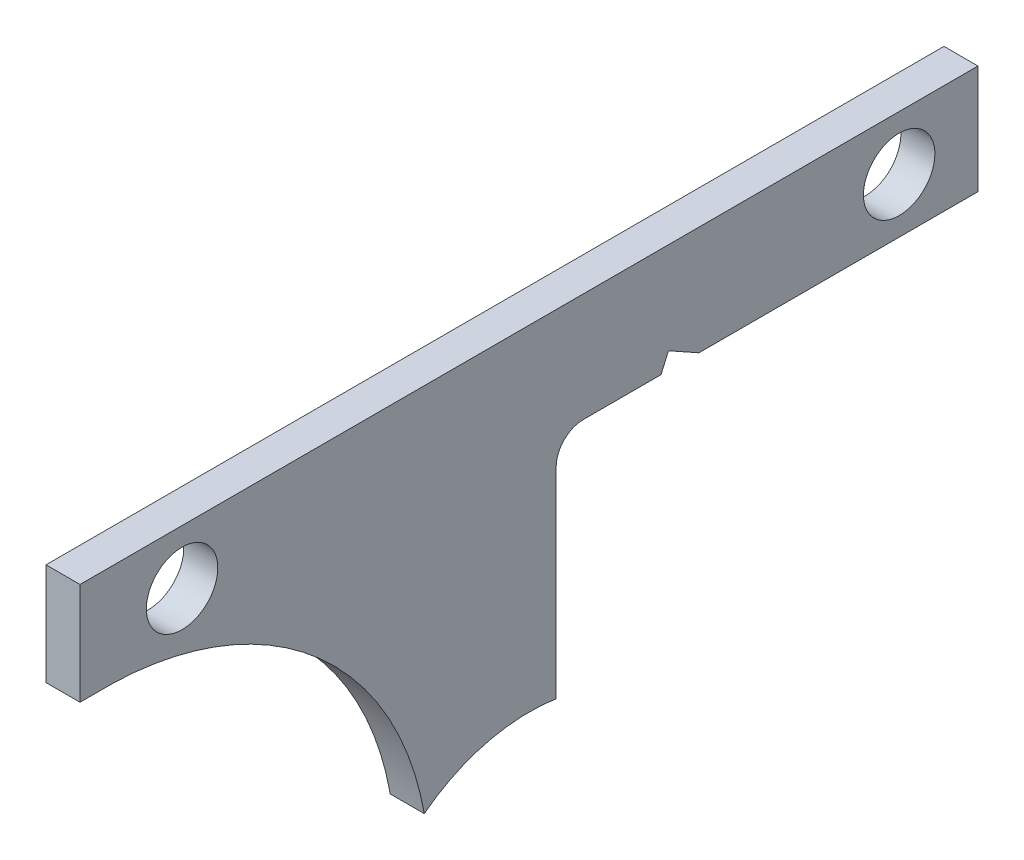
ISO-10303-21;
HEADER;
FILE_DESCRIPTION(('STEP AP214'),'2;1');
FILE_NAME('part.step','',(''),(''),'','','');
FILE_SCHEMA(('AUTOMOTIVE_DESIGN { 1 0 10303 214 1 1 1 1 }'));
ENDSEC;
DATA;
#1=APPLICATION_CONTEXT('core data for automotive mechanical design processes');
#2=APPLICATION_PROTOCOL_DEFINITION('international standard','automotive_design',2000,#1);
#3=PRODUCT_CONTEXT('',#1,'mechanical');
#4=PRODUCT('Part','Part','',(#3));
#5=PRODUCT_RELATED_PRODUCT_CATEGORY('part','',(#4));
#6=PRODUCT_DEFINITION_FORMATION('','',#4);
#7=PRODUCT_DEFINITION_CONTEXT('part definition',#1,'design');
#8=PRODUCT_DEFINITION('design','',#6,#7);
#9=PRODUCT_DEFINITION_SHAPE('','',#8);
#10=(LENGTH_UNIT() NAMED_UNIT(*) SI_UNIT(.MILLI.,.METRE.));
#11=(NAMED_UNIT(*) PLANE_ANGLE_UNIT() SI_UNIT($,.RADIAN.));
#12=(NAMED_UNIT(*) SI_UNIT($,.STERADIAN.) SOLID_ANGLE_UNIT());
#13=UNCERTAINTY_MEASURE_WITH_UNIT(LENGTH_MEASURE(1.E-05),#10,'distance_accuracy_value','');
#14=(GEOMETRIC_REPRESENTATION_CONTEXT(3) GLOBAL_UNCERTAINTY_ASSIGNED_CONTEXT((#13)) GLOBAL_UNIT_ASSIGNED_CONTEXT((#10,
#11,#12)) REPRESENTATION_CONTEXT('',''));
#15=CARTESIAN_POINT('',(0.,0.,0.));
#16=DIRECTION('',(0.,0.,1.));
#17=DIRECTION('',(1.,0.,0.));
#18=AXIS2_PLACEMENT_3D('',#15,#16,#17);
#19=CARTESIAN_POINT('',(-316.5,185.,219.999999999998));
#20=CARTESIAN_POINT('',(-316.5,183.738271044699,181.204081790223));
#21=CARTESIAN_POINT('',(-316.5,145.523335737097,174.397177271133));
#22=CARTESIAN_POINT('',(-321.5,185.,219.999999999998));
#23=CARTESIAN_POINT('',(-321.5,183.738271044699,181.204081790223));
#24=CARTESIAN_POINT('',(-321.5,145.523335737097,174.397177271133));
#25=(BOUNDED_SURFACE() B_SPLINE_SURFACE(1,2,((#19,#20,#21),(#22,#23,#24)),.UNSPECIFIED.,.F.,.F.,
.F.) B_SPLINE_SURFACE_WITH_KNOTS((2,2),(3,3),(-0.0104379405019257,0.0939414645173316),
(0.0325107499581212,1.3945234553188),
.UNSPECIFIED.) GEOMETRIC_REPRESENTATION_ITEM() RATIONAL_B_SPLINE_SURFACE(((1.,0.776939537570949,
1.),(1.,0.776939537570949,1.))) REPRESENTATION_ITEM('') SURFACE());
#26=CARTESIAN_POINT('',(-321.5,145.523335737097,174.397177271133));
#27=CARTESIAN_POINT('',(-321.5,183.738271044699,181.204081790223));
#28=CARTESIAN_POINT('',(-321.5,185.,219.999999999998));
#29=(BOUNDED_CURVE() B_SPLINE_CURVE(2,(#26,#27,#28),.UNSPECIFIED.,.F.,
.F.) B_SPLINE_CURVE_WITH_KNOTS((3,3),(-1.3945234553188,-0.0325107499581212),
.UNSPECIFIED.) CURVE() GEOMETRIC_REPRESENTATION_ITEM() RATIONAL_B_SPLINE_CURVE((1.,
0.776939537570949,1.)) REPRESENTATION_ITEM(''));
#30=CARTESIAN_POINT('',(-321.5,145.523335737097,174.397177271133));
#31=VERTEX_POINT('',#30);
#32=CARTESIAN_POINT('',(-321.5,185.,219.999999999998));
#33=VERTEX_POINT('',#32);
#34=EDGE_CURVE('E11',#31,#33,#29,.T.);
#35=CARTESIAN_POINT('',(-316.5,145.523335737097,174.397177271133));
#36=CARTESIAN_POINT('',(-321.5,145.523335737097,174.397177271133));
#37=(BOUNDED_CURVE() B_SPLINE_CURVE(1,(#35,#36),.UNSPECIFIED.,.F.,
.F.) B_SPLINE_CURVE_WITH_KNOTS((2,2),(-0.45,0.05),
.UNSPECIFIED.) CURVE() GEOMETRIC_REPRESENTATION_ITEM() RATIONAL_B_SPLINE_CURVE((1.,1.)) REPRESENTATION_ITEM(''));
#38=CARTESIAN_POINT('',(-316.5,145.523335737097,174.397177271133));
#39=VERTEX_POINT('',#38);
#40=EDGE_CURVE('E40',#39,#31,#37,.T.);
#41=CARTESIAN_POINT('',(-316.5,185.,219.999999999998));
#42=CARTESIAN_POINT('',(-316.5,183.738271044699,181.204081790223));
#43=CARTESIAN_POINT('',(-316.5,145.523335737097,174.397177271133));
#44=(BOUNDED_CURVE() B_SPLINE_CURVE(2,(#41,#42,#43),.UNSPECIFIED.,.F.,
.F.) B_SPLINE_CURVE_WITH_KNOTS((3,3),(0.0325107499581212,1.3945234553188),
.UNSPECIFIED.) CURVE() GEOMETRIC_REPRESENTATION_ITEM() RATIONAL_B_SPLINE_CURVE((1.,
0.776939537570949,1.)) REPRESENTATION_ITEM(''));
#45=CARTESIAN_POINT('',(-316.5,185.,219.999999999998));
#46=VERTEX_POINT('',#45);
#47=EDGE_CURVE('E149',#46,#39,#44,.T.);
#48=CARTESIAN_POINT('',(-321.5,185.,219.999999999998));
#49=CARTESIAN_POINT('',(-316.5,185.,219.999999999998));
#50=(BOUNDED_CURVE() B_SPLINE_CURVE(1,(#48,#49),.UNSPECIFIED.,.F.,
.F.) B_SPLINE_CURVE_WITH_KNOTS((2,2),(-0.05,0.45),
.UNSPECIFIED.) CURVE() GEOMETRIC_REPRESENTATION_ITEM() RATIONAL_B_SPLINE_CURVE((1.,1.)) REPRESENTATION_ITEM(''));
#51=EDGE_CURVE('E179',#33,#46,#50,.T.);
#52=ORIENTED_EDGE('',*,*,#34,.F.);
#53=ORIENTED_EDGE('',*,*,#40,.F.);
#54=ORIENTED_EDGE('',*,*,#47,.F.);
#55=ORIENTED_EDGE('',*,*,#51,.F.);
#56=EDGE_LOOP('',(#52,#53,#54,#55));
#57=FACE_BOUND('',#56,.T.);
#58=ADVANCED_FACE('F16',(#57),#25,.T.);
#59=CARTESIAN_POINT('',(-321.5,145.513335737097,225.009999999998));
#60=CARTESIAN_POINT('',(-321.5,145.513335737097,92.9900013881491));
#61=CARTESIAN_POINT('',(-321.5,200.01,225.009999999998));
#62=CARTESIAN_POINT('',(-321.5,200.01,92.9900013881491));
#63=(BOUNDED_SURFACE() B_SPLINE_SURFACE(1,1,((#59,#60),(#61,#62)),.UNSPECIFIED.,.F.,.F.,
.F.) B_SPLINE_SURFACE_WITH_KNOTS((2,2),(2,2),(1.2513335737095,6.70099999999985),
(-6.50099999999984,6.70099986118509),
.UNSPECIFIED.) GEOMETRIC_REPRESENTATION_ITEM() RATIONAL_B_SPLINE_SURFACE(((1.,1.),(1.,1.))) REPRESENTATION_ITEM('') SURFACE());
#64=CARTESIAN_POINT('',(-321.5,185.,219.999999999998));
#65=CARTESIAN_POINT('',(-321.5,185.,224.999999999998));
#66=(BOUNDED_CURVE() B_SPLINE_CURVE(1,(#64,#65),.UNSPECIFIED.,.F.,
.F.) B_SPLINE_CURVE_WITH_KNOTS((2,2),(2.99999999999992,3.49999999999992),
.UNSPECIFIED.) CURVE() GEOMETRIC_REPRESENTATION_ITEM() RATIONAL_B_SPLINE_CURVE((1.,1.)) REPRESENTATION_ITEM(''));
#67=CARTESIAN_POINT('',(-321.5,185.,224.999999999998));
#68=VERTEX_POINT('',#67);
#69=EDGE_CURVE('E31',#33,#68,#66,.T.);
#70=CARTESIAN_POINT('',(-321.5,200.,224.999999999998));
#71=CARTESIAN_POINT('',(-321.5,185.,224.999999999998));
#72=(BOUNDED_CURVE() B_SPLINE_CURVE(1,(#70,#71),.UNSPECIFIED.,.F.,
.F.) B_SPLINE_CURVE_WITH_KNOTS((2,2),(-3.29999999999992,-1.79999999999992),
.UNSPECIFIED.) CURVE() GEOMETRIC_REPRESENTATION_ITEM() RATIONAL_B_SPLINE_CURVE((1.,1.)) REPRESENTATION_ITEM(''));
#73=CARTESIAN_POINT('',(-321.5,200.,224.999999999998));
#74=VERTEX_POINT('',#73);
#75=EDGE_CURVE('E227',#74,#68,#72,.T.);
#76=CARTESIAN_POINT('',(-321.5,200.,93.0000013881491));
#77=CARTESIAN_POINT('',(-321.5,200.,224.999999999998));
#78=(BOUNDED_CURVE() B_SPLINE_CURVE(1,(#76,#77),.UNSPECIFIED.,.F.,
.F.) B_SPLINE_CURVE_WITH_KNOTS((2,2),(-3.7000609657488,9.49993889543614),
.UNSPECIFIED.) CURVE() GEOMETRIC_REPRESENTATION_ITEM() RATIONAL_B_SPLINE_CURVE((1.,1.)) REPRESENTATION_ITEM(''));
#79=CARTESIAN_POINT('',(-321.5,200.,93.0000013881491));
#80=VERTEX_POINT('',#79);
#81=EDGE_CURVE('E387',#80,#74,#78,.T.);
#82=CARTESIAN_POINT('',(-321.5,184.000001489994,93.0000013881491));
#83=CARTESIAN_POINT('',(-321.5,200.,93.0000013881491));
#84=(BOUNDED_CURVE() B_SPLINE_CURVE(1,(#82,#83),.UNSPECIFIED.,.F.,
.F.) B_SPLINE_CURVE_WITH_KNOTS((2,2),(2.45000014899932,4.04999999999992),
.UNSPECIFIED.) CURVE() GEOMETRIC_REPRESENTATION_ITEM() RATIONAL_B_SPLINE_CURVE((1.,1.)) REPRESENTATION_ITEM(''));
#85=CARTESIAN_POINT('',(-321.5,184.000001489994,93.0000013881491));
#86=VERTEX_POINT('',#85);
#87=EDGE_CURVE('E304',#86,#80,#84,.T.);
#88=CARTESIAN_POINT('',(-321.5,184.000001489994,93.0000013881491));
#89=CARTESIAN_POINT('',(-321.5,184.000001489994,134.029372648002));
#90=(BOUNDED_CURVE() B_SPLINE_CURVE(1,(#88,#89),.UNSPECIFIED.,.F.,
.F.) B_SPLINE_CURVE_WITH_KNOTS((2,2),(-6.19999986118509,-2.09706273519983),
.UNSPECIFIED.) CURVE() GEOMETRIC_REPRESENTATION_ITEM() RATIONAL_B_SPLINE_CURVE((1.,1.)) REPRESENTATION_ITEM(''));
#91=CARTESIAN_POINT('',(-321.5,184.000001489994,134.029372648002));
#92=VERTEX_POINT('',#91);
#93=EDGE_CURVE('E199',#86,#92,#90,.T.);
#94=CARTESIAN_POINT('',(-321.5,184.000001489994,134.029372648002));
#95=CARTESIAN_POINT('',(-321.5,186.499999798834,138.499999679625));
#96=(BOUNDED_CURVE() B_SPLINE_CURVE(1,(#94,#95),.UNSPECIFIED.,.F.,
.F.) B_SPLINE_CURVE_WITH_KNOTS((2,2),(-0.144876145952486,0.367339605465649),
.UNSPECIFIED.) CURVE() GEOMETRIC_REPRESENTATION_ITEM() RATIONAL_B_SPLINE_CURVE((1.,1.)) REPRESENTATION_ITEM(''));
#97=CARTESIAN_POINT('',(-321.5,186.499999798834,138.499999679625));
#98=VERTEX_POINT('',#97);
#99=EDGE_CURVE('E138',#92,#98,#96,.T.);
#100=CARTESIAN_POINT('',(-321.5,186.499999798834,138.499999679625));
#101=CARTESIAN_POINT('',(-321.5,184.000001489994,139.600149694138));
#102=(BOUNDED_CURVE() B_SPLINE_CURVE(1,(#100,#101),.UNSPECIFIED.,.F.,
.F.) B_SPLINE_CURVE_WITH_KNOTS((2,2),(-3.01797486716644,-2.74483897427363),
.UNSPECIFIED.) CURVE() GEOMETRIC_REPRESENTATION_ITEM() RATIONAL_B_SPLINE_CURVE((1.,1.)) REPRESENTATION_ITEM(''));
#103=CARTESIAN_POINT('',(-321.5,184.000001489994,139.600149694138));
#104=VERTEX_POINT('',#103);
#105=EDGE_CURVE('E130',#98,#104,#102,.T.);
#106=CARTESIAN_POINT('',(-321.5,184.000001489994,139.600149694138));
#107=CARTESIAN_POINT('',(-321.5,184.000001489994,151.));
#108=(BOUNDED_CURVE() B_SPLINE_CURVE(1,(#106,#107),.UNSPECIFIED.,.F.,
.F.) B_SPLINE_CURVE_WITH_KNOTS((2,2),(-1.28998503058624,-0.150000000000003),
.UNSPECIFIED.) CURVE() GEOMETRIC_REPRESENTATION_ITEM() RATIONAL_B_SPLINE_CURVE((1.,1.)) REPRESENTATION_ITEM(''));
#109=CARTESIAN_POINT('',(-321.5,184.000001489994,151.));
#110=VERTEX_POINT('',#109);
#111=EDGE_CURVE('E119',#104,#110,#108,.T.);
#112=CARTESIAN_POINT('',(-321.5,180.000001489994,155.));
#113=CARTESIAN_POINT('',(-321.5,184.000001489994,155.));
#114=CARTESIAN_POINT('',(-321.5,184.000001489994,151.));
#115=(BOUNDED_CURVE() B_SPLINE_CURVE(2,(#112,#113,#114),.UNSPECIFIED.,.F.,
.F.) B_SPLINE_CURVE_WITH_KNOTS((3,3),(-0.785398163397449,0.785398163397448),
.UNSPECIFIED.) CURVE() GEOMETRIC_REPRESENTATION_ITEM() RATIONAL_B_SPLINE_CURVE((1.,
0.707106781186548,1.)) REPRESENTATION_ITEM(''));
#116=CARTESIAN_POINT('',(-321.5,180.000001489994,155.));
#117=VERTEX_POINT('',#116);
#118=EDGE_CURVE('E197',#117,#110,#115,.T.);
#119=CARTESIAN_POINT('',(-321.5,150.42810164539,155.));
#120=CARTESIAN_POINT('',(-321.5,180.000001489994,155.));
#121=(BOUNDED_CURVE() B_SPLINE_CURVE(1,(#119,#120),.UNSPECIFIED.,.F.,
.F.) B_SPLINE_CURVE_WITH_KNOTS((2,2),(0.868885329190994,3.82607531365144),
.UNSPECIFIED.) CURVE() GEOMETRIC_REPRESENTATION_ITEM() RATIONAL_B_SPLINE_CURVE((1.,1.)) REPRESENTATION_ITEM(''));
#122=CARTESIAN_POINT('',(-321.5,150.42810164539,155.));
#123=VERTEX_POINT('',#122);
#124=EDGE_CURVE('E320',#123,#117,#121,.T.);
#125=CARTESIAN_POINT('',(-321.5,150.42810164539,155.));
#126=CARTESIAN_POINT('',(-321.5,152.156402297052,165.755715357486));
#127=CARTESIAN_POINT('',(-321.5,145.523335737097,174.397177271133));
#128=(BOUNDED_CURVE() B_SPLINE_CURVE(2,(#125,#126,#127),.UNSPECIFIED.,.F.,
.F.) B_SPLINE_CURVE_WITH_KNOTS((3,3),(-1.12934142198298,-0.315355076255859),
.UNSPECIFIED.) CURVE() GEOMETRIC_REPRESENTATION_ITEM() RATIONAL_B_SPLINE_CURVE((1.,
0.918315224508935,1.)) REPRESENTATION_ITEM(''));
#129=EDGE_CURVE('E131',#123,#31,#128,.T.);
#130=CARTESIAN_POINT('',(-321.5,186.750000000002,210.));
#131=CARTESIAN_POINT('',(-321.5,186.750000000002,204.75));
#132=CARTESIAN_POINT('',(-321.5,192.000000000002,204.75));
#133=CARTESIAN_POINT('',(-321.5,197.250000000002,204.75));
#134=CARTESIAN_POINT('',(-321.5,197.250000000002,210.));
#135=CARTESIAN_POINT('',(-321.5,197.250000000002,215.25));
#136=CARTESIAN_POINT('',(-321.5,192.000000000002,215.25));
#137=CARTESIAN_POINT('',(-321.5,186.750000000002,215.25));
#138=CARTESIAN_POINT('',(-321.5,186.750000000002,210.));
#139=(BOUNDED_CURVE() B_SPLINE_CURVE(2,(#130,#131,#132,#133,#134,#135,#136,#137,#138),
.UNSPECIFIED.,.T.,.F.) B_SPLINE_CURVE_WITH_KNOTS((3,2,2,2,3),(-3.14159265358979,
-1.5707963267949,0.,1.5707963267949,3.14159265358979),
.UNSPECIFIED.) CURVE() GEOMETRIC_REPRESENTATION_ITEM() RATIONAL_B_SPLINE_CURVE((1.,
0.707106781186547,1.,0.707106781186547,1.,0.707106781186547,1.,0.707106781186547,1.)) REPRESENTATION_ITEM(''));
#140=CARTESIAN_POINT('',(-321.5,186.750000000002,210.));
#141=VERTEX_POINT('',#140);
#142=EDGE_CURVE('E253',#141,#141,#139,.T.);
#143=CARTESIAN_POINT('',(-321.5,186.750000000002,104.591492462718));
#144=CARTESIAN_POINT('',(-321.5,186.750000000002,99.3414924627182));
#145=CARTESIAN_POINT('',(-321.5,192.000000000002,99.3414924627182));
#146=CARTESIAN_POINT('',(-321.5,197.250000000002,99.3414924627182));
#147=CARTESIAN_POINT('',(-321.5,197.250000000002,104.591492462718));
#148=CARTESIAN_POINT('',(-321.5,197.250000000002,109.841492462718));
#149=CARTESIAN_POINT('',(-321.5,192.000000000002,109.841492462718));
#150=CARTESIAN_POINT('',(-321.5,186.750000000002,109.841492462718));
#151=CARTESIAN_POINT('',(-321.5,186.750000000002,104.591492462718));
#152=(BOUNDED_CURVE() B_SPLINE_CURVE(2,(#143,#144,#145,#146,#147,#148,#149,#150,#151),
.UNSPECIFIED.,.T.,.F.) B_SPLINE_CURVE_WITH_KNOTS((3,2,2,2,3),(-3.14159265358979,
-1.5707963267949,0.,1.5707963267949,3.14159265358979),
.UNSPECIFIED.) CURVE() GEOMETRIC_REPRESENTATION_ITEM() RATIONAL_B_SPLINE_CURVE((1.,
0.707106781186547,1.,0.707106781186547,1.,0.707106781186547,1.,0.707106781186547,1.)) REPRESENTATION_ITEM(''));
#153=CARTESIAN_POINT('',(-321.5,186.750000000002,104.591492462718));
#154=VERTEX_POINT('',#153);
#155=EDGE_CURVE('E262',#154,#154,#152,.T.);
#156=ORIENTED_EDGE('',*,*,#34,.T.);
#157=ORIENTED_EDGE('',*,*,#69,.T.);
#158=ORIENTED_EDGE('',*,*,#75,.F.);
#159=ORIENTED_EDGE('',*,*,#81,.F.);
#160=ORIENTED_EDGE('',*,*,#87,.F.);
#161=ORIENTED_EDGE('',*,*,#93,.T.);
#162=ORIENTED_EDGE('',*,*,#99,.T.);
#163=ORIENTED_EDGE('',*,*,#105,.T.);
#164=ORIENTED_EDGE('',*,*,#111,.T.);
#165=ORIENTED_EDGE('',*,*,#118,.F.);
#166=ORIENTED_EDGE('',*,*,#124,.F.);
#167=ORIENTED_EDGE('',*,*,#129,.T.);
#168=EDGE_LOOP('',(#156,#157,#158,#159,#160,#161,#162,#163,#164,#165,#166,#167));
#169=FACE_BOUND('',#168,.T.);
#170=ORIENTED_EDGE('',*,*,#142,.T.);
#171=EDGE_LOOP('',(#170));
#172=FACE_BOUND('',#171,.T.);
#173=ORIENTED_EDGE('',*,*,#155,.T.);
#174=EDGE_LOOP('',(#173));
#175=FACE_BOUND('',#174,.T.);
#176=ADVANCED_FACE('F134',(#169,#172,#175),#63,.T.);
#177=CARTESIAN_POINT('',(-321.51,185.,219.989999999998));
#178=CARTESIAN_POINT('',(-321.51,185.,225.009999999998));
#179=CARTESIAN_POINT('',(-316.49,185.,219.989999999998));
#180=CARTESIAN_POINT('',(-316.49,185.,225.009999999998));
#181=(BOUNDED_SURFACE() B_SPLINE_SURFACE(1,1,((#177,#178),(#179,#180)),.UNSPECIFIED.,.F.,.F.,
.F.) B_SPLINE_SURFACE_WITH_KNOTS((2,2),(2,2),(-0.051,0.451),(-0.001,0.501),
.UNSPECIFIED.) GEOMETRIC_REPRESENTATION_ITEM() RATIONAL_B_SPLINE_SURFACE(((1.,1.),(1.,1.))) REPRESENTATION_ITEM('') SURFACE());
#182=CARTESIAN_POINT('',(-316.5,185.,219.999999999998));
#183=CARTESIAN_POINT('',(-316.5,185.,224.999999999998));
#184=(BOUNDED_CURVE() B_SPLINE_CURVE(1,(#182,#183),.UNSPECIFIED.,.F.,
.F.) B_SPLINE_CURVE_WITH_KNOTS((2,2),(2.99999999999992,3.49999999999992),
.UNSPECIFIED.) CURVE() GEOMETRIC_REPRESENTATION_ITEM() RATIONAL_B_SPLINE_CURVE((1.,1.)) REPRESENTATION_ITEM(''));
#185=CARTESIAN_POINT('',(-316.5,185.,224.999999999998));
#186=VERTEX_POINT('',#185);
#187=EDGE_CURVE('E171',#46,#186,#184,.T.);
#188=CARTESIAN_POINT('',(-321.5,185.,224.999999999998));
#189=CARTESIAN_POINT('',(-316.5,185.,224.999999999998));
#190=(BOUNDED_CURVE() B_SPLINE_CURVE(1,(#188,#189),.UNSPECIFIED.,.F.,
.F.) B_SPLINE_CURVE_WITH_KNOTS((2,2),(-0.05,0.45),
.UNSPECIFIED.) CURVE() GEOMETRIC_REPRESENTATION_ITEM() RATIONAL_B_SPLINE_CURVE((1.,1.)) REPRESENTATION_ITEM(''));
#191=EDGE_CURVE('E180',#68,#186,#190,.T.);
#192=ORIENTED_EDGE('',*,*,#69,.F.);
#193=ORIENTED_EDGE('',*,*,#51,.T.);
#194=ORIENTED_EDGE('',*,*,#187,.T.);
#195=ORIENTED_EDGE('',*,*,#191,.F.);
#196=EDGE_LOOP('',(#192,#193,#194,#195));
#197=FACE_BOUND('',#196,.T.);
#198=ADVANCED_FACE('F533',(#197),#181,.T.);
#199=CARTESIAN_POINT('',(-316.49,184.99,224.999999999998));
#200=CARTESIAN_POINT('',(-321.51,184.99,224.999999999998));
#201=CARTESIAN_POINT('',(-316.49,200.01,224.999999999998));
#202=CARTESIAN_POINT('',(-321.51,200.01,224.999999999998));
#203=(BOUNDED_SURFACE() B_SPLINE_SURFACE(1,1,((#199,#200),(#201,#202)),.UNSPECIFIED.,.F.,.F.,
.F.) B_SPLINE_SURFACE_WITH_KNOTS((2,2),(2,2),(-1.601,-0.099),(-0.451,0.051),
.UNSPECIFIED.) GEOMETRIC_REPRESENTATION_ITEM() RATIONAL_B_SPLINE_SURFACE(((1.,1.),(1.,1.))) REPRESENTATION_ITEM('') SURFACE());
#204=CARTESIAN_POINT('',(-316.5,185.,224.999999999998));
#205=CARTESIAN_POINT('',(-316.5,200.,224.999999999998));
#206=(BOUNDED_CURVE() B_SPLINE_CURVE(1,(#204,#205),.UNSPECIFIED.,.F.,
.F.) B_SPLINE_CURVE_WITH_KNOTS((2,2),(1.79999999999992,3.29999999999992),
.UNSPECIFIED.) CURVE() GEOMETRIC_REPRESENTATION_ITEM() RATIONAL_B_SPLINE_CURVE((1.,1.)) REPRESENTATION_ITEM(''));
#207=CARTESIAN_POINT('',(-316.5,200.,224.999999999998));
#208=VERTEX_POINT('',#207);
#209=EDGE_CURVE('E226',#186,#208,#206,.T.);
#210=CARTESIAN_POINT('',(-316.5,200.,224.999999999998));
#211=CARTESIAN_POINT('',(-321.5,200.,224.999999999998));
#212=(BOUNDED_CURVE() B_SPLINE_CURVE(1,(#210,#211),.UNSPECIFIED.,.F.,
.F.) B_SPLINE_CURVE_WITH_KNOTS((2,2),(-0.45,0.05),
.UNSPECIFIED.) CURVE() GEOMETRIC_REPRESENTATION_ITEM() RATIONAL_B_SPLINE_CURVE((1.,1.)) REPRESENTATION_ITEM(''));
#213=EDGE_CURVE('E217',#208,#74,#212,.T.);
#214=ORIENTED_EDGE('',*,*,#191,.T.);
#215=ORIENTED_EDGE('',*,*,#209,.T.);
#216=ORIENTED_EDGE('',*,*,#213,.T.);
#217=ORIENTED_EDGE('',*,*,#75,.T.);
#218=EDGE_LOOP('',(#214,#215,#216,#217));
#219=FACE_BOUND('',#218,.T.);
#220=ADVANCED_FACE('F550',(#219),#203,.T.);
#221=CARTESIAN_POINT('',(-316.49,183.995120737495,134.020644632475));
#222=CARTESIAN_POINT('',(-321.51,183.995120737495,134.020644632475));
#223=CARTESIAN_POINT('',(-316.49,186.504880551334,138.508727695152));
#224=CARTESIAN_POINT('',(-321.51,186.504880551334,138.508727695152));
#225=(BOUNDED_SURFACE() B_SPLINE_SURFACE(1,1,((#221,#222),(#223,#224)),.UNSPECIFIED.,.F.,.F.,
.F.) B_SPLINE_SURFACE_WITH_KNOTS((2,2),(2,2),(-0.0010000000000005,0.513215751418136),(-0.051,
0.451),.UNSPECIFIED.) GEOMETRIC_REPRESENTATION_ITEM() RATIONAL_B_SPLINE_SURFACE(((1.,1.),(1.,1.))) REPRESENTATION_ITEM('') SURFACE());
#226=CARTESIAN_POINT('',(-316.5,186.499999798834,138.499999679625));
#227=CARTESIAN_POINT('',(-316.5,184.000002920505,134.029375206115));
#228=(BOUNDED_CURVE() B_SPLINE_CURVE(1,(#226,#227),.UNSPECIFIED.,.F.,
.F.) B_SPLINE_CURVE_WITH_KNOTS((2,2),(-0.367339605465649,0.144875852860258),
.UNSPECIFIED.) CURVE() GEOMETRIC_REPRESENTATION_ITEM() RATIONAL_B_SPLINE_CURVE((1.,1.)) REPRESENTATION_ITEM(''));
#229=CARTESIAN_POINT('',(-316.5,186.499999798834,138.499999679625));
#230=VERTEX_POINT('',#229);
#231=CARTESIAN_POINT('',(-316.5,184.000001489994,134.029372648002));
#232=VERTEX_POINT('',#231);
#233=EDGE_CURVE('E295',#230,#232,#228,.T.);
#234=CARTESIAN_POINT('',(-316.5,186.499999798834,138.499999679625));
#235=CARTESIAN_POINT('',(-321.5,186.499999798834,138.499999679625));
#236=(BOUNDED_CURVE() B_SPLINE_CURVE(1,(#234,#235),.UNSPECIFIED.,.F.,
.F.) B_SPLINE_CURVE_WITH_KNOTS((2,2),(-0.05,0.45),
.UNSPECIFIED.) CURVE() GEOMETRIC_REPRESENTATION_ITEM() RATIONAL_B_SPLINE_CURVE((1.,1.)) REPRESENTATION_ITEM(''));
#237=EDGE_CURVE('E403',#230,#98,#236,.T.);
#238=CARTESIAN_POINT('',(-316.5,184.000001489994,134.029372648002));
#239=CARTESIAN_POINT('',(-321.5,184.000001489994,134.029372648002));
#240=(BOUNDED_CURVE() B_SPLINE_CURVE(1,(#238,#239),.UNSPECIFIED.,.F.,
.F.) B_SPLINE_CURVE_WITH_KNOTS((2,2),(-0.25,0.25),
.UNSPECIFIED.) CURVE() GEOMETRIC_REPRESENTATION_ITEM() RATIONAL_B_SPLINE_CURVE((1.,1.)) REPRESENTATION_ITEM(''));
#241=EDGE_CURVE('E158',#232,#92,#240,.T.);
#242=ORIENTED_EDGE('',*,*,#233,.F.);
#243=ORIENTED_EDGE('',*,*,#237,.T.);
#244=ORIENTED_EDGE('',*,*,#99,.F.);
#245=ORIENTED_EDGE('',*,*,#241,.F.);
#246=EDGE_LOOP('',(#242,#243,#244,#245));
#247=FACE_BOUND('',#246,.T.);
#248=ADVANCED_FACE('F464',(#247),#225,.T.);
#249=CARTESIAN_POINT('',(-316.49,186.509152745678,138.495971831059));
#250=CARTESIAN_POINT('',(-321.51,186.509152745678,138.495971831059));
#251=CARTESIAN_POINT('',(-316.49,183.99084854315,139.604177542704));
#252=CARTESIAN_POINT('',(-321.51,183.99084854315,139.604177542704));
#253=(BOUNDED_SURFACE() B_SPLINE_SURFACE(1,1,((#249,#250),(#251,#252)),.UNSPECIFIED.,.F.,.F.,
.F.) B_SPLINE_SURFACE_WITH_KNOTS((2,2),(2,2),(-0.00100015628954575,0.274135736603264),(-0.051,
0.451),.UNSPECIFIED.) GEOMETRIC_REPRESENTATION_ITEM() RATIONAL_B_SPLINE_SURFACE(((1.,1.),(1.,1.))) REPRESENTATION_ITEM('') SURFACE());
#254=CARTESIAN_POINT('',(-316.5,184.000001489994,139.600149694138));
#255=CARTESIAN_POINT('',(-316.5,186.499999798834,138.499999679625));
#256=(BOUNDED_CURVE() B_SPLINE_CURVE(1,(#254,#255),.UNSPECIFIED.,.F.,
.F.) B_SPLINE_CURVE_WITH_KNOTS((2,2),(2.74483897427363,3.01797486716644),
.UNSPECIFIED.) CURVE() GEOMETRIC_REPRESENTATION_ITEM() RATIONAL_B_SPLINE_CURVE((1.,1.)) REPRESENTATION_ITEM(''));
#257=CARTESIAN_POINT('',(-316.5,184.000001489994,139.600149694138));
#258=VERTEX_POINT('',#257);
#259=EDGE_CURVE('E146',#258,#230,#256,.T.);
#260=CARTESIAN_POINT('',(-321.5,184.000001489994,139.600149694138));
#261=CARTESIAN_POINT('',(-316.5,184.000001489994,139.600149694138));
#262=(BOUNDED_CURVE() B_SPLINE_CURVE(1,(#260,#261),.UNSPECIFIED.,.F.,
.F.) B_SPLINE_CURVE_WITH_KNOTS((2,2),(-0.25,0.25),
.UNSPECIFIED.) CURVE() GEOMETRIC_REPRESENTATION_ITEM() RATIONAL_B_SPLINE_CURVE((1.,1.)) REPRESENTATION_ITEM(''));
#263=EDGE_CURVE('E124',#104,#258,#262,.T.);
#264=ORIENTED_EDGE('',*,*,#259,.F.);
#265=ORIENTED_EDGE('',*,*,#263,.F.);
#266=ORIENTED_EDGE('',*,*,#105,.F.);
#267=ORIENTED_EDGE('',*,*,#237,.F.);
#268=EDGE_LOOP('',(#264,#265,#266,#267));
#269=FACE_BOUND('',#268,.T.);
#270=ADVANCED_FACE('F144',(#269),#253,.T.);
#271=CARTESIAN_POINT('',(-321.51,184.000001489994,134.039372648002));
#272=CARTESIAN_POINT('',(-316.49,184.000001489994,134.039372648002));
#273=CARTESIAN_POINT('',(-321.51,184.000001489994,92.9900013881491));
#274=CARTESIAN_POINT('',(-316.49,184.000001489994,92.9900013881491));
#275=(BOUNDED_SURFACE() B_SPLINE_SURFACE(1,1,((#271,#272),(#273,#274)),.UNSPECIFIED.,.F.,.F.,
.F.) B_SPLINE_SURFACE_WITH_KNOTS((2,2),(2,2),(1.59606273519983,5.70099986118508),(-0.051,0.451),
.UNSPECIFIED.) GEOMETRIC_REPRESENTATION_ITEM() RATIONAL_B_SPLINE_SURFACE(((1.,1.),(1.,1.))) REPRESENTATION_ITEM('') SURFACE());
#276=CARTESIAN_POINT('',(-321.5,184.000001489994,93.0000013881491));
#277=CARTESIAN_POINT('',(-316.5,184.000001489994,93.0000013881491));
#278=(BOUNDED_CURVE() B_SPLINE_CURVE(1,(#276,#277),.UNSPECIFIED.,.F.,
.F.) B_SPLINE_CURVE_WITH_KNOTS((2,2),(-0.05,0.45),
.UNSPECIFIED.) CURVE() GEOMETRIC_REPRESENTATION_ITEM() RATIONAL_B_SPLINE_CURVE((1.,1.)) REPRESENTATION_ITEM(''));
#279=CARTESIAN_POINT('',(-316.5,184.000001489994,93.0000013881491));
#280=VERTEX_POINT('',#279);
#281=EDGE_CURVE('E148',#86,#280,#278,.T.);
#282=CARTESIAN_POINT('',(-316.5,184.000001489994,134.029372648002));
#283=CARTESIAN_POINT('',(-316.5,184.000001489994,93.0000013881491));
#284=(BOUNDED_CURVE() B_SPLINE_CURVE(1,(#282,#283),.UNSPECIFIED.,.F.,
.F.) B_SPLINE_CURVE_WITH_KNOTS((2,2),(2.09706273519983,6.19999986118509),
.UNSPECIFIED.) CURVE() GEOMETRIC_REPRESENTATION_ITEM() RATIONAL_B_SPLINE_CURVE((1.,1.)) REPRESENTATION_ITEM(''));
#285=EDGE_CURVE('E236',#232,#280,#284,.T.);
#286=ORIENTED_EDGE('',*,*,#241,.T.);
#287=ORIENTED_EDGE('',*,*,#93,.F.);
#288=ORIENTED_EDGE('',*,*,#281,.T.);
#289=ORIENTED_EDGE('',*,*,#285,.F.);
#290=EDGE_LOOP('',(#286,#287,#288,#289));
#291=FACE_BOUND('',#290,.T.);
#292=ADVANCED_FACE('F460',(#291),#275,.T.);
#293=CARTESIAN_POINT('',(-321.51,184.000001489994,151.01));
#294=CARTESIAN_POINT('',(-316.49,184.000001489994,151.01));
#295=CARTESIAN_POINT('',(-321.51,184.000001489994,139.590149694138));
#296=CARTESIAN_POINT('',(-316.49,184.000001489994,139.590149694138));
#297=(BOUNDED_SURFACE() B_SPLINE_SURFACE(1,1,((#293,#294),(#295,#296)),.UNSPECIFIED.,.F.,.F.,
.F.) B_SPLINE_SURFACE_WITH_KNOTS((2,2),(2,2),(-0.601,0.540985030586231),(-0.051,0.451),
.UNSPECIFIED.) GEOMETRIC_REPRESENTATION_ITEM() RATIONAL_B_SPLINE_SURFACE(((1.,1.),(1.,1.))) REPRESENTATION_ITEM('') SURFACE());
#298=CARTESIAN_POINT('',(-316.5,184.000001489994,151.));
#299=CARTESIAN_POINT('',(-316.5,184.000001489994,139.600149694138));
#300=(BOUNDED_CURVE() B_SPLINE_CURVE(1,(#298,#299),.UNSPECIFIED.,.F.,
.F.) B_SPLINE_CURVE_WITH_KNOTS((2,2),(0.150000000000003,1.28998503058624),
.UNSPECIFIED.) CURVE() GEOMETRIC_REPRESENTATION_ITEM() RATIONAL_B_SPLINE_CURVE((1.,1.)) REPRESENTATION_ITEM(''));
#301=CARTESIAN_POINT('',(-316.5,184.000001489994,151.));
#302=VERTEX_POINT('',#301);
#303=EDGE_CURVE('E412',#302,#258,#300,.T.);
#304=CARTESIAN_POINT('',(-321.5,184.000001489994,151.));
#305=CARTESIAN_POINT('',(-316.5,184.000001489994,151.));
#306=(BOUNDED_CURVE() B_SPLINE_CURVE(1,(#304,#305),.UNSPECIFIED.,.F.,
.F.) B_SPLINE_CURVE_WITH_KNOTS((2,2),(-0.05,0.45),
.UNSPECIFIED.) CURVE() GEOMETRIC_REPRESENTATION_ITEM() RATIONAL_B_SPLINE_CURVE((1.,1.)) REPRESENTATION_ITEM(''));
#307=EDGE_CURVE('E126',#110,#302,#306,.T.);
#308=ORIENTED_EDGE('',*,*,#263,.T.);
#309=ORIENTED_EDGE('',*,*,#303,.F.);
#310=ORIENTED_EDGE('',*,*,#307,.F.);
#311=ORIENTED_EDGE('',*,*,#111,.F.);
#312=EDGE_LOOP('',(#308,#309,#310,#311));
#313=FACE_BOUND('',#312,.T.);
#314=ADVANCED_FACE('F121',(#313),#297,.T.);
#315=CARTESIAN_POINT('',(-316.5,200.01,225.009999999998));
#316=CARTESIAN_POINT('',(-316.5,200.01,92.9900013881491));
#317=CARTESIAN_POINT('',(-316.5,145.513335737097,225.009999999998));
#318=CARTESIAN_POINT('',(-316.5,145.513335737097,92.9900013881491));
#319=(BOUNDED_SURFACE() B_SPLINE_SURFACE(1,1,((#315,#316),(#317,#318)),.UNSPECIFIED.,.F.,.F.,
.F.) B_SPLINE_SURFACE_WITH_KNOTS((2,2),(2,2),(1.2513335737095,6.70099999999985),
(-6.50099999999984,6.70099986118509),
.UNSPECIFIED.) GEOMETRIC_REPRESENTATION_ITEM() RATIONAL_B_SPLINE_SURFACE(((1.,1.),(1.,1.))) REPRESENTATION_ITEM('') SURFACE());
#320=CARTESIAN_POINT('',(-316.5,145.523335737097,174.397177271133));
#321=CARTESIAN_POINT('',(-316.5,152.156402297052,165.755715357486));
#322=CARTESIAN_POINT('',(-316.5,150.42810164539,155.));
#323=(BOUNDED_CURVE() B_SPLINE_CURVE(2,(#320,#321,#322),.UNSPECIFIED.,.F.,
.F.) B_SPLINE_CURVE_WITH_KNOTS((3,3),(0.315355076255859,1.12934142198298),
.UNSPECIFIED.) CURVE() GEOMETRIC_REPRESENTATION_ITEM() RATIONAL_B_SPLINE_CURVE((1.,
0.918315224508935,1.)) REPRESENTATION_ITEM(''));
#324=CARTESIAN_POINT('',(-316.5,150.42810164539,155.));
#325=VERTEX_POINT('',#324);
#326=EDGE_CURVE('E162',#39,#325,#323,.T.);
#327=CARTESIAN_POINT('',(-316.5,150.42810164539,155.));
#328=CARTESIAN_POINT('',(-316.5,180.000001489994,155.));
#329=(BOUNDED_CURVE() B_SPLINE_CURVE(1,(#327,#328),.UNSPECIFIED.,.F.,
.F.) B_SPLINE_CURVE_WITH_KNOTS((2,2),(0.868885329190994,3.82607531365144),
.UNSPECIFIED.) CURVE() GEOMETRIC_REPRESENTATION_ITEM() RATIONAL_B_SPLINE_CURVE((1.,1.)) REPRESENTATION_ITEM(''));
#330=CARTESIAN_POINT('',(-316.5,180.000001489994,155.));
#331=VERTEX_POINT('',#330);
#332=EDGE_CURVE('E189',#325,#331,#329,.T.);
#333=CARTESIAN_POINT('',(-316.5,184.000001489994,151.));
#334=CARTESIAN_POINT('',(-316.5,184.000001489994,155.));
#335=CARTESIAN_POINT('',(-316.5,180.000001489994,155.));
#336=(BOUNDED_CURVE() B_SPLINE_CURVE(2,(#333,#334,#335),.UNSPECIFIED.,.F.,
.F.) B_SPLINE_CURVE_WITH_KNOTS((3,3),(-0.785398163397448,0.785398163397449),
.UNSPECIFIED.) CURVE() GEOMETRIC_REPRESENTATION_ITEM() RATIONAL_B_SPLINE_CURVE((1.,
0.707106781186548,1.)) REPRESENTATION_ITEM(''));
#337=EDGE_CURVE('E198',#302,#331,#336,.T.);
#338=CARTESIAN_POINT('',(-316.5,184.000001489994,93.0000013881491));
#339=CARTESIAN_POINT('',(-316.5,200.,93.0000013881491));
#340=(BOUNDED_CURVE() B_SPLINE_CURVE(1,(#338,#339),.UNSPECIFIED.,.F.,
.F.) B_SPLINE_CURVE_WITH_KNOTS((2,2),(2.45000014899932,4.04999999999992),
.UNSPECIFIED.) CURVE() GEOMETRIC_REPRESENTATION_ITEM() RATIONAL_B_SPLINE_CURVE((1.,1.)) REPRESENTATION_ITEM(''));
#341=CARTESIAN_POINT('',(-316.5,200.,93.0000013881491));
#342=VERTEX_POINT('',#341);
#343=EDGE_CURVE('E228',#280,#342,#340,.T.);
#344=CARTESIAN_POINT('',(-316.5,200.,93.0000013881491));
#345=CARTESIAN_POINT('',(-316.5,200.,224.999999999998));
#346=(BOUNDED_CURVE() B_SPLINE_CURVE(1,(#344,#345),.UNSPECIFIED.,.F.,
.F.) B_SPLINE_CURVE_WITH_KNOTS((2,2),(-3.7000609657488,9.49993889543614),
.UNSPECIFIED.) CURVE() GEOMETRIC_REPRESENTATION_ITEM() RATIONAL_B_SPLINE_CURVE((1.,1.)) REPRESENTATION_ITEM(''));
#347=EDGE_CURVE('E237',#342,#208,#346,.T.);
#348=CARTESIAN_POINT('',(-316.5,186.750000000002,210.));
#349=CARTESIAN_POINT('',(-316.5,186.750000000002,215.25));
#350=CARTESIAN_POINT('',(-316.5,192.000000000002,215.25));
#351=CARTESIAN_POINT('',(-316.5,197.250000000002,215.25));
#352=CARTESIAN_POINT('',(-316.5,197.250000000002,210.));
#353=CARTESIAN_POINT('',(-316.5,197.250000000002,204.75));
#354=CARTESIAN_POINT('',(-316.5,192.000000000002,204.75));
#355=CARTESIAN_POINT('',(-316.5,186.750000000002,204.75));
#356=CARTESIAN_POINT('',(-316.5,186.750000000002,210.));
#357=(BOUNDED_CURVE() B_SPLINE_CURVE(2,(#348,#349,#350,#351,#352,#353,#354,#355,#356),
.UNSPECIFIED.,.T.,.F.) B_SPLINE_CURVE_WITH_KNOTS((3,2,2,2,3),(-3.14159265358979,
-1.5707963267949,0.,1.5707963267949,3.14159265358979),
.UNSPECIFIED.) CURVE() GEOMETRIC_REPRESENTATION_ITEM() RATIONAL_B_SPLINE_CURVE((1.,
0.707106781186547,1.,0.707106781186547,1.,0.707106781186547,1.,0.707106781186547,1.)) REPRESENTATION_ITEM(''));
#358=CARTESIAN_POINT('',(-316.5,186.750000000002,210.));
#359=VERTEX_POINT('',#358);
#360=EDGE_CURVE('E252',#359,#359,#357,.T.);
#361=CARTESIAN_POINT('',(-316.5,186.750000000002,104.591492462718));
#362=CARTESIAN_POINT('',(-316.5,186.750000000002,109.841492462718));
#363=CARTESIAN_POINT('',(-316.5,192.000000000002,109.841492462718));
#364=CARTESIAN_POINT('',(-316.5,197.250000000002,109.841492462718));
#365=CARTESIAN_POINT('',(-316.5,197.250000000002,104.591492462718));
#366=CARTESIAN_POINT('',(-316.5,197.250000000002,99.3414924627182));
#367=CARTESIAN_POINT('',(-316.5,192.000000000002,99.3414924627182));
#368=CARTESIAN_POINT('',(-316.5,186.750000000002,99.3414924627182));
#369=CARTESIAN_POINT('',(-316.5,186.750000000002,104.591492462718));
#370=(BOUNDED_CURVE() B_SPLINE_CURVE(2,(#361,#362,#363,#364,#365,#366,#367,#368,#369),
.UNSPECIFIED.,.T.,.F.) B_SPLINE_CURVE_WITH_KNOTS((3,2,2,2,3),(-3.14159265358979,
-1.5707963267949,0.,1.5707963267949,3.14159265358979),
.UNSPECIFIED.) CURVE() GEOMETRIC_REPRESENTATION_ITEM() RATIONAL_B_SPLINE_CURVE((1.,
0.707106781186547,1.,0.707106781186547,1.,0.707106781186547,1.,0.707106781186547,1.)) REPRESENTATION_ITEM(''));
#371=CARTESIAN_POINT('',(-316.5,186.750000000002,104.591492462718));
#372=VERTEX_POINT('',#371);
#373=EDGE_CURVE('E271',#372,#372,#370,.T.);
#374=ORIENTED_EDGE('',*,*,#47,.T.);
#375=ORIENTED_EDGE('',*,*,#326,.T.);
#376=ORIENTED_EDGE('',*,*,#332,.T.);
#377=ORIENTED_EDGE('',*,*,#337,.F.);
#378=ORIENTED_EDGE('',*,*,#303,.T.);
#379=ORIENTED_EDGE('',*,*,#259,.T.);
#380=ORIENTED_EDGE('',*,*,#233,.T.);
#381=ORIENTED_EDGE('',*,*,#285,.T.);
#382=ORIENTED_EDGE('',*,*,#343,.T.);
#383=ORIENTED_EDGE('',*,*,#347,.T.);
#384=ORIENTED_EDGE('',*,*,#209,.F.);
#385=ORIENTED_EDGE('',*,*,#187,.F.);
#386=EDGE_LOOP('',(#374,#375,#376,#377,#378,#379,#380,#381,#382,#383,#384,#385));
#387=FACE_BOUND('',#386,.T.);
#388=ORIENTED_EDGE('',*,*,#360,.T.);
#389=EDGE_LOOP('',(#388));
#390=FACE_BOUND('',#389,.T.);
#391=ORIENTED_EDGE('',*,*,#373,.T.);
#392=EDGE_LOOP('',(#391));
#393=FACE_BOUND('',#392,.T.);
#394=ADVANCED_FACE('F472',(#387,#390,#393),#319,.T.);
#395=CARTESIAN_POINT('',(-321.5,184.000001489994,151.));
#396=CARTESIAN_POINT('',(-321.5,184.000001489994,155.));
#397=CARTESIAN_POINT('',(-321.5,180.000001489994,155.));
#398=CARTESIAN_POINT('',(-316.5,184.000001489994,151.));
#399=CARTESIAN_POINT('',(-316.5,184.000001489994,155.));
#400=CARTESIAN_POINT('',(-316.5,180.000001489994,155.));
#401=(BOUNDED_SURFACE() B_SPLINE_SURFACE(1,2,((#395,#396,#397),(#398,#399,#400)),.UNSPECIFIED.,
.F.,.F.,.F.) B_SPLINE_SURFACE_WITH_KNOTS((2,2),(3,3),(-0.125,1.125),(-0.785398163397448,
0.785398163397449),
.UNSPECIFIED.) GEOMETRIC_REPRESENTATION_ITEM() RATIONAL_B_SPLINE_SURFACE(((1.,0.707106781186547,
1.),(1.,0.707106781186547,1.))) REPRESENTATION_ITEM('') SURFACE());
#402=CARTESIAN_POINT('',(-316.5,180.000001489994,155.));
#403=CARTESIAN_POINT('',(-321.5,180.000001489994,155.));
#404=(BOUNDED_CURVE() B_SPLINE_CURVE(1,(#402,#403),.UNSPECIFIED.,.F.,
.F.) B_SPLINE_CURVE_WITH_KNOTS((2,2),(-0.45,0.05),
.UNSPECIFIED.) CURVE() GEOMETRIC_REPRESENTATION_ITEM() RATIONAL_B_SPLINE_CURVE((1.,1.)) REPRESENTATION_ITEM(''));
#405=EDGE_CURVE('E336',#331,#117,#404,.T.);
#406=ORIENTED_EDGE('',*,*,#118,.T.);
#407=ORIENTED_EDGE('',*,*,#307,.T.);
#408=ORIENTED_EDGE('',*,*,#337,.T.);
#409=ORIENTED_EDGE('',*,*,#405,.T.);
#410=EDGE_LOOP('',(#406,#407,#408,#409));
#411=FACE_BOUND('',#410,.T.);
#412=ADVANCED_FACE('F510',(#411),#401,.T.);
#413=CARTESIAN_POINT('',(-321.5,150.42810164539,155.));
#414=CARTESIAN_POINT('',(-321.5,152.156402297052,165.755715357486));
#415=CARTESIAN_POINT('',(-321.5,145.523335737097,174.397177271133));
#416=CARTESIAN_POINT('',(-316.5,150.42810164539,155.));
#417=CARTESIAN_POINT('',(-316.5,152.156402297052,165.755715357486));
#418=CARTESIAN_POINT('',(-316.5,145.523335737097,174.397177271133));
#419=(BOUNDED_SURFACE() B_SPLINE_SURFACE(1,2,((#413,#414,#415),(#416,#417,#418)),.UNSPECIFIED.,
.F.,.F.,.F.) B_SPLINE_SURFACE_WITH_KNOTS((2,2),(3,3),(-0.0197848990158529,0.178064091142677),
(-1.12934142198298,-0.315355076255859),
.UNSPECIFIED.) GEOMETRIC_REPRESENTATION_ITEM() RATIONAL_B_SPLINE_SURFACE(((1.,0.918315224508932,
1.),(1.,0.918315224508932,1.))) REPRESENTATION_ITEM('') SURFACE());
#420=CARTESIAN_POINT('',(-316.5,150.42810164539,155.));
#421=CARTESIAN_POINT('',(-321.5,150.42810164539,155.));
#422=(BOUNDED_CURVE() B_SPLINE_CURVE(1,(#420,#421),.UNSPECIFIED.,.F.,
.F.) B_SPLINE_CURVE_WITH_KNOTS((2,2),(-0.45,0.05),
.UNSPECIFIED.) CURVE() GEOMETRIC_REPRESENTATION_ITEM() RATIONAL_B_SPLINE_CURVE((1.,1.)) REPRESENTATION_ITEM(''));
#423=EDGE_CURVE('E311',#325,#123,#422,.T.);
#424=ORIENTED_EDGE('',*,*,#40,.T.);
#425=ORIENTED_EDGE('',*,*,#129,.F.);
#426=ORIENTED_EDGE('',*,*,#423,.F.);
#427=ORIENTED_EDGE('',*,*,#326,.F.);
#428=EDGE_LOOP('',(#424,#425,#426,#427));
#429=FACE_BOUND('',#428,.T.);
#430=ADVANCED_FACE('F515',(#429),#419,.T.);
#431=CARTESIAN_POINT('',(-321.51,150.41810164539,155.));
#432=CARTESIAN_POINT('',(-316.49,150.41810164539,155.));
#433=CARTESIAN_POINT('',(-321.51,180.010001489994,155.));
#434=CARTESIAN_POINT('',(-316.49,180.010001489994,155.));
#435=(BOUNDED_SURFACE() B_SPLINE_SURFACE(1,1,((#431,#432),(#433,#434)),.UNSPECIFIED.,.F.,.F.,
.F.) B_SPLINE_SURFACE_WITH_KNOTS((2,2),(2,2),(-0.00603950615680004,2.95315047830365),(-0.051,
0.451),.UNSPECIFIED.) GEOMETRIC_REPRESENTATION_ITEM() RATIONAL_B_SPLINE_SURFACE(((1.,1.),(1.,1.))) REPRESENTATION_ITEM('') SURFACE());
#436=ORIENTED_EDGE('',*,*,#405,.F.);
#437=ORIENTED_EDGE('',*,*,#332,.F.);
#438=ORIENTED_EDGE('',*,*,#423,.T.);
#439=ORIENTED_EDGE('',*,*,#124,.T.);
#440=EDGE_LOOP('',(#436,#437,#438,#439));
#441=FACE_BOUND('',#440,.T.);
#442=ADVANCED_FACE('F514',(#441),#435,.T.);
#443=CARTESIAN_POINT('',(-316.5,186.750000000002,210.));
#444=CARTESIAN_POINT('',(-316.5,186.750000000002,215.25));
#445=CARTESIAN_POINT('',(-316.5,192.000000000002,215.25));
#446=CARTESIAN_POINT('',(-316.5,197.250000000002,215.25));
#447=CARTESIAN_POINT('',(-316.5,197.250000000002,210.));
#448=CARTESIAN_POINT('',(-316.5,197.250000000002,204.75));
#449=CARTESIAN_POINT('',(-316.5,192.000000000002,204.75));
#450=CARTESIAN_POINT('',(-316.5,186.750000000002,204.75));
#451=CARTESIAN_POINT('',(-316.5,186.750000000002,210.));
#452=CARTESIAN_POINT('',(-321.5,186.750000000002,210.));
#453=CARTESIAN_POINT('',(-321.5,186.750000000002,215.25));
#454=CARTESIAN_POINT('',(-321.5,192.000000000002,215.25));
#455=CARTESIAN_POINT('',(-321.5,197.250000000002,215.25));
#456=CARTESIAN_POINT('',(-321.5,197.250000000002,210.));
#457=CARTESIAN_POINT('',(-321.5,197.250000000002,204.75));
#458=CARTESIAN_POINT('',(-321.5,192.000000000002,204.75));
#459=CARTESIAN_POINT('',(-321.5,186.750000000002,204.75));
#460=CARTESIAN_POINT('',(-321.5,186.750000000002,210.));
#461=(BOUNDED_SURFACE() B_SPLINE_SURFACE(1,2,((#443,#444,#445,#446,#447,#448,#449,#450,#451),
(#452,#453,#454,#455,#456,#457,#458,#459,#460)),.UNSPECIFIED.,.F.,.T.,
.F.) B_SPLINE_SURFACE_WITH_KNOTS((2,2),(3,2,2,2,3),(24.8888888888889,26.),(-3.14159265358979,
-1.5707963267949,0.,1.5707963267949,3.14159265358979),
.UNSPECIFIED.) GEOMETRIC_REPRESENTATION_ITEM() RATIONAL_B_SPLINE_SURFACE(((1.,0.707106781186548,
1.,0.707106781186548,1.,0.707106781186548,1.,0.707106781186548,1.),(1.,0.707106781186548,1.,
0.707106781186548,1.,0.707106781186548,1.,0.707106781186548,1.))) REPRESENTATION_ITEM('') SURFACE());
#462=CARTESIAN_POINT('',(-316.5,186.750000000002,210.));
#463=CARTESIAN_POINT('',(-321.5,186.750000000002,210.));
#464=(BOUNDED_CURVE() B_SPLINE_CURVE(1,(#462,#463),.UNSPECIFIED.,.F.,
.F.) B_SPLINE_CURVE_WITH_KNOTS((2,2),(24.8888888888889,26.),
.UNSPECIFIED.) CURVE() GEOMETRIC_REPRESENTATION_ITEM() RATIONAL_B_SPLINE_CURVE((1.,1.)) REPRESENTATION_ITEM(''));
#465=EDGE_CURVE('E22',#359,#141,#464,.T.);
#466=ORIENTED_EDGE('',*,*,#360,.F.);
#467=ORIENTED_EDGE('',*,*,#465,.T.);
#468=ORIENTED_EDGE('',*,*,#142,.F.);
#469=ORIENTED_EDGE('',*,*,#465,.F.);
#470=EDGE_LOOP('',(#466,#467,#468,#469));
#471=FACE_BOUND('',#470,.T.);
#472=ADVANCED_FACE('F18',(#471),#461,.T.);
#473=CARTESIAN_POINT('',(-316.5,186.750000000002,104.591492462718));
#474=CARTESIAN_POINT('',(-316.5,186.750000000002,109.841492462718));
#475=CARTESIAN_POINT('',(-316.5,192.000000000002,109.841492462718));
#476=CARTESIAN_POINT('',(-316.5,197.250000000002,109.841492462718));
#477=CARTESIAN_POINT('',(-316.5,197.250000000002,104.591492462718));
#478=CARTESIAN_POINT('',(-316.5,197.250000000002,99.3414924627182));
#479=CARTESIAN_POINT('',(-316.5,192.000000000002,99.3414924627182));
#480=CARTESIAN_POINT('',(-316.5,186.750000000002,99.3414924627182));
#481=CARTESIAN_POINT('',(-316.5,186.750000000002,104.591492462718));
#482=CARTESIAN_POINT('',(-321.5,186.750000000002,104.591492462718));
#483=CARTESIAN_POINT('',(-321.5,186.750000000002,109.841492462718));
#484=CARTESIAN_POINT('',(-321.5,192.000000000002,109.841492462718));
#485=CARTESIAN_POINT('',(-321.5,197.250000000002,109.841492462718));
#486=CARTESIAN_POINT('',(-321.5,197.250000000002,104.591492462718));
#487=CARTESIAN_POINT('',(-321.5,197.250000000002,99.3414924627182));
#488=CARTESIAN_POINT('',(-321.5,192.000000000002,99.3414924627182));
#489=CARTESIAN_POINT('',(-321.5,186.750000000002,99.3414924627182));
#490=CARTESIAN_POINT('',(-321.5,186.750000000002,104.591492462718));
#491=(BOUNDED_SURFACE() B_SPLINE_SURFACE(1,2,((#473,#474,#475,#476,#477,#478,#479,#480,#481),
(#482,#483,#484,#485,#486,#487,#488,#489,#490)),.UNSPECIFIED.,.F.,.T.,
.F.) B_SPLINE_SURFACE_WITH_KNOTS((2,2),(3,2,2,2,3),(24.8888888888889,26.),(-3.14159265358979,
-1.5707963267949,0.,1.5707963267949,3.14159265358979),
.UNSPECIFIED.) GEOMETRIC_REPRESENTATION_ITEM() RATIONAL_B_SPLINE_SURFACE(((1.,0.707106781186548,
1.,0.707106781186548,1.,0.707106781186548,1.,0.707106781186548,1.),(1.,0.707106781186548,1.,
0.707106781186548,1.,0.707106781186548,1.,0.707106781186548,1.))) REPRESENTATION_ITEM('') SURFACE());
#492=CARTESIAN_POINT('',(-316.5,186.750000000002,104.591492462718));
#493=CARTESIAN_POINT('',(-321.5,186.750000000002,104.591492462718));
#494=(BOUNDED_CURVE() B_SPLINE_CURVE(1,(#492,#493),.UNSPECIFIED.,.F.,
.F.) B_SPLINE_CURVE_WITH_KNOTS((2,2),(24.8888888888889,26.),
.UNSPECIFIED.) CURVE() GEOMETRIC_REPRESENTATION_ITEM() RATIONAL_B_SPLINE_CURVE((1.,1.)) REPRESENTATION_ITEM(''));
#495=EDGE_CURVE('E427',#372,#154,#494,.T.);
#496=ORIENTED_EDGE('',*,*,#373,.F.);
#497=ORIENTED_EDGE('',*,*,#495,.T.);
#498=ORIENTED_EDGE('',*,*,#155,.F.);
#499=ORIENTED_EDGE('',*,*,#495,.F.);
#500=EDGE_LOOP('',(#496,#497,#498,#499));
#501=FACE_BOUND('',#500,.T.);
#502=ADVANCED_FACE('F581',(#501),#491,.T.);
#503=CARTESIAN_POINT('',(-321.51,200.,92.9900013881491));
#504=CARTESIAN_POINT('',(-316.49,200.,92.9900013881491));
#505=CARTESIAN_POINT('',(-321.51,200.,225.009999999998));
#506=CARTESIAN_POINT('',(-316.49,200.,225.009999999998));
#507=(BOUNDED_SURFACE() B_SPLINE_SURFACE(1,1,((#503,#504),(#505,#506)),.UNSPECIFIED.,.F.,.F.,
.F.) B_SPLINE_SURFACE_WITH_KNOTS((2,2),(2,2),(-0.701122070312502,12.5008777908724),(-0.051,
0.451),.UNSPECIFIED.) GEOMETRIC_REPRESENTATION_ITEM() RATIONAL_B_SPLINE_SURFACE(((1.,1.),(1.,1.))) REPRESENTATION_ITEM('') SURFACE());
#508=CARTESIAN_POINT('',(-321.5,200.,93.0000013881491));
#509=CARTESIAN_POINT('',(-316.5,200.,93.0000013881491));
#510=(BOUNDED_CURVE() B_SPLINE_CURVE(1,(#508,#509),.UNSPECIFIED.,.F.,
.F.) B_SPLINE_CURVE_WITH_KNOTS((2,2),(-0.05,0.45),
.UNSPECIFIED.) CURVE() GEOMETRIC_REPRESENTATION_ITEM() RATIONAL_B_SPLINE_CURVE((1.,1.)) REPRESENTATION_ITEM(''));
#511=EDGE_CURVE('E296',#80,#342,#510,.T.);
#512=ORIENTED_EDGE('',*,*,#81,.T.);
#513=ORIENTED_EDGE('',*,*,#213,.F.);
#514=ORIENTED_EDGE('',*,*,#347,.F.);
#515=ORIENTED_EDGE('',*,*,#511,.F.);
#516=EDGE_LOOP('',(#512,#513,#514,#515));
#517=FACE_BOUND('',#516,.T.);
#518=ADVANCED_FACE('F570',(#517),#507,.T.);
#519=CARTESIAN_POINT('',(-321.51,183.990001489994,93.0000013881491));
#520=CARTESIAN_POINT('',(-316.49,183.990001489994,93.0000013881491));
#521=CARTESIAN_POINT('',(-321.51,200.01,93.0000013881491));
#522=CARTESIAN_POINT('',(-316.49,200.01,93.0000013881491));
#523=(BOUNDED_SURFACE() B_SPLINE_SURFACE(1,1,((#519,#520),(#521,#522)),.UNSPECIFIED.,.F.,.F.,
.F.) B_SPLINE_SURFACE_WITH_KNOTS((2,2),(2,2),(-0.200999851000605,1.401),(-0.051,0.451),
.UNSPECIFIED.) GEOMETRIC_REPRESENTATION_ITEM() RATIONAL_B_SPLINE_SURFACE(((1.,1.),(1.,1.))) REPRESENTATION_ITEM('') SURFACE());
#524=ORIENTED_EDGE('',*,*,#87,.T.);
#525=ORIENTED_EDGE('',*,*,#511,.T.);
#526=ORIENTED_EDGE('',*,*,#343,.F.);
#527=ORIENTED_EDGE('',*,*,#281,.F.);
#528=EDGE_LOOP('',(#524,#525,#526,#527));
#529=FACE_BOUND('',#528,.T.);
#530=ADVANCED_FACE('F469',(#529),#523,.T.);
#531=CLOSED_SHELL('',(#58,#176,#198,#220,#248,#270,#292,#314,#394,#412,#430,#442,#472,#502,#518,#530));
#532=MANIFOLD_SOLID_BREP('B1',#531);
#533=ADVANCED_BREP_SHAPE_REPRESENTATION('',(#18,#532),#14);
#534=SHAPE_DEFINITION_REPRESENTATION(#9,#533);
ENDSEC;
END-ISO-10303-21;
